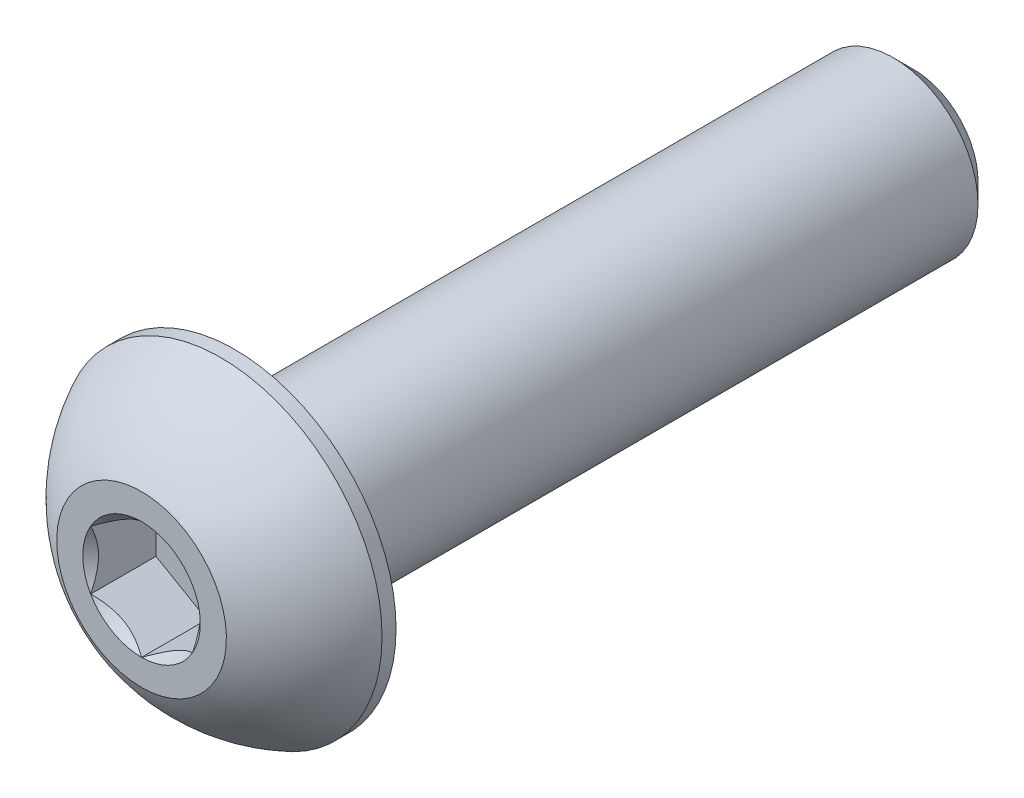
ISO-10303-21;
HEADER;
FILE_DESCRIPTION(('STEP AP214'),'2;1');
FILE_NAME('part.step','',(''),(''),'','','');
FILE_SCHEMA(('AUTOMOTIVE_DESIGN { 1 0 10303 214 1 1 1 1 }'));
ENDSEC;
DATA;
#1=APPLICATION_CONTEXT('core data for automotive mechanical design processes');
#2=APPLICATION_PROTOCOL_DEFINITION('international standard','automotive_design',2000,#1);
#3=PRODUCT_CONTEXT('',#1,'mechanical');
#4=PRODUCT('Part','Part','',(#3));
#5=PRODUCT_RELATED_PRODUCT_CATEGORY('part','',(#4));
#6=PRODUCT_DEFINITION_FORMATION('','',#4);
#7=PRODUCT_DEFINITION_CONTEXT('part definition',#1,'design');
#8=PRODUCT_DEFINITION('design','',#6,#7);
#9=PRODUCT_DEFINITION_SHAPE('','',#8);
#10=(LENGTH_UNIT() NAMED_UNIT(*) SI_UNIT(.MILLI.,.METRE.));
#11=(NAMED_UNIT(*) PLANE_ANGLE_UNIT() SI_UNIT($,.RADIAN.));
#12=(NAMED_UNIT(*) SI_UNIT($,.STERADIAN.) SOLID_ANGLE_UNIT());
#13=UNCERTAINTY_MEASURE_WITH_UNIT(LENGTH_MEASURE(1.E-05),#10,'distance_accuracy_value','');
#14=(GEOMETRIC_REPRESENTATION_CONTEXT(3) GLOBAL_UNCERTAINTY_ASSIGNED_CONTEXT((#13)) GLOBAL_UNIT_ASSIGNED_CONTEXT((#10,
#11,#12)) REPRESENTATION_CONTEXT('',''));
#15=CARTESIAN_POINT('',(0.,0.,0.));
#16=DIRECTION('',(0.,0.,1.));
#17=DIRECTION('',(1.,0.,0.));
#18=AXIS2_PLACEMENT_3D('',#15,#16,#17);
#19=CARTESIAN_POINT('',(0.,0.,-22.75));
#20=DIRECTION('',(0.,0.,1.));
#21=DIRECTION('',(1.,0.,0.));
#22=AXIS2_PLACEMENT_3D('',#19,#20,#21);
#23=PLANE('',#22);
#24=CARTESIAN_POINT('',(0.,0.,-22.75));
#25=DIRECTION('',(0.,0.,1.));
#26=DIRECTION('',(1.,0.,0.));
#27=AXIS2_PLACEMENT_3D('',#24,#25,#26);
#28=CIRCLE('',#27,1.90000000000001);
#29=CARTESIAN_POINT('',(1.90000000000001,0.,-22.75));
#30=VERTEX_POINT('',#29);
#31=EDGE_CURVE('E50',#30,#30,#28,.T.);
#32=ORIENTED_EDGE('',*,*,#31,.F.);
#33=EDGE_LOOP('',(#32));
#34=FACE_BOUND('',#33,.T.);
#35=ADVANCED_FACE('F37',(#34),#23,.F.);
#36=CARTESIAN_POINT('',(0.,0.,-22.75));
#37=DIRECTION('',(0.,0.,1.));
#38=DIRECTION('',(1.,0.,0.));
#39=AXIS2_PLACEMENT_3D('',#36,#37,#38);
#40=CONICAL_SURFACE('',#39,1.90000000000001,0.785398163397447);
#41=CARTESIAN_POINT('',(0.,0.,-22.15));
#42=DIRECTION('',(0.,0.,1.));
#43=DIRECTION('',(1.,0.,0.));
#44=AXIS2_PLACEMENT_3D('',#41,#42,#43);
#45=CIRCLE('',#44,2.50000000000001);
#46=CARTESIAN_POINT('',(2.50000000000001,0.,-22.15));
#47=VERTEX_POINT('',#46);
#48=EDGE_CURVE('E176',#47,#47,#45,.T.);
#49=ORIENTED_EDGE('',*,*,#48,.F.);
#50=EDGE_LOOP('',(#49));
#51=FACE_BOUND('',#50,.T.);
#52=ORIENTED_EDGE('',*,*,#31,.T.);
#53=EDGE_LOOP('',(#52));
#54=FACE_BOUND('',#53,.T.);
#55=ADVANCED_FACE('F181',(#51,#54),#40,.T.);
#56=CARTESIAN_POINT('',(0.,0.,0.));
#57=DIRECTION('',(0.,0.,1.));
#58=DIRECTION('',(1.,0.,0.));
#59=AXIS2_PLACEMENT_3D('',#56,#57,#58);
#60=CYLINDRICAL_SURFACE('',#59,2.50000000000001);
#61=CARTESIAN_POINT('',(0.,0.,-2.75));
#62=DIRECTION('',(0.,0.,1.));
#63=DIRECTION('',(1.,0.,0.));
#64=AXIS2_PLACEMENT_3D('',#61,#62,#63);
#65=CIRCLE('',#64,2.50000000000001);
#66=CARTESIAN_POINT('',(2.50000000000001,0.,-2.75));
#67=VERTEX_POINT('',#66);
#68=EDGE_CURVE('E173',#67,#67,#65,.T.);
#69=ORIENTED_EDGE('',*,*,#68,.F.);
#70=EDGE_LOOP('',(#69));
#71=FACE_BOUND('',#70,.T.);
#72=ORIENTED_EDGE('',*,*,#48,.T.);
#73=EDGE_LOOP('',(#72));
#74=FACE_BOUND('',#73,.T.);
#75=ADVANCED_FACE('F187',(#71,#74),#60,.T.);
#76=CARTESIAN_POINT('',(0.,-4.75,-2.75));
#77=DIRECTION('',(0.,0.,1.));
#78=DIRECTION('',(1.,0.,0.));
#79=AXIS2_PLACEMENT_3D('',#76,#77,#78);
#80=PLANE('',#79);
#81=CARTESIAN_POINT('',(0.,0.,-2.75));
#82=DIRECTION('',(0.,0.,1.));
#83=DIRECTION('',(1.,0.,0.));
#84=AXIS2_PLACEMENT_3D('',#81,#82,#83);
#85=CIRCLE('',#84,4.75);
#86=CARTESIAN_POINT('',(4.75,0.,-2.75));
#87=VERTEX_POINT('',#86);
#88=EDGE_CURVE('E167',#87,#87,#85,.T.);
#89=ORIENTED_EDGE('',*,*,#88,.F.);
#90=EDGE_LOOP('',(#89));
#91=FACE_BOUND('',#90,.T.);
#92=ORIENTED_EDGE('',*,*,#68,.T.);
#93=EDGE_LOOP('',(#92));
#94=FACE_BOUND('',#93,.T.);
#95=ADVANCED_FACE('F192',(#91,#94),#80,.F.);
#96=CARTESIAN_POINT('',(0.,0.,-4.65805481283422));
#97=DIRECTION('',(0.,0.,1.));
#98=DIRECTION('',(0.,-1.,0.));
#99=AXIS2_PLACEMENT_3D('',#96,#97,#98);
#100=SPHERICAL_SURFACE('',#99,5.28653711226623);
#101=CARTESIAN_POINT('',(0.,0.,0.));
#102=DIRECTION('',(0.,0.,1.));
#103=DIRECTION('',(1.,0.,0.));
#104=AXIS2_PLACEMENT_3D('',#101,#102,#103);
#105=CIRCLE('',#104,2.50000000000001);
#106=CARTESIAN_POINT('',(0.,-2.50000000000002,0.));
#107=VERTEX_POINT('',#106);
#108=EDGE_CURVE('E170',#107,#107,#105,.T.);
#109=CARTESIAN_POINT('',(0.,0.,-2.3375));
#110=DIRECTION('',(0.,0.,1.));
#111=DIRECTION('',(1.,0.,0.));
#112=AXIS2_PLACEMENT_3D('',#109,#110,#111);
#113=CIRCLE('',#112,4.75);
#114=CARTESIAN_POINT('',(0.,-4.75,-2.3375));
#115=VERTEX_POINT('',#114);
#116=EDGE_CURVE('E164',#115,#115,#113,.T.);
#117=CARTESIAN_POINT('',(0.,-2.50000000000002,0.));
#118=CARTESIAN_POINT('',(0.,-2.53026679982019,-0.0162442824556097));
#119=CARTESIAN_POINT('',(0.,-2.56037522904969,-0.0327836412064135));
#120=CARTESIAN_POINT('',(0.,-2.62026400427659,-0.0664460518821879));
#121=CARTESIAN_POINT('',(0.,-2.65004435027398,-0.0835691038071584));
#122=CARTESIAN_POINT('',(0.,-2.70926561698585,-0.118392441415041));
#123=CARTESIAN_POINT('',(0.,-2.73870653770034,-0.136092727097953));
#124=CARTESIAN_POINT('',(0.,-2.79723777417105,-0.172063794044947));
#125=CARTESIAN_POINT('',(0.,-2.82632808992727,-0.190334575309028));
#126=CARTESIAN_POINT('',(0.,-2.88414706107591,-0.227439694392678));
#127=CARTESIAN_POINT('',(0.,-2.91287571646832,-0.246274032212247));
#128=CARTESIAN_POINT('',(0.,-2.96996045130295,-0.284499106978591));
#129=CARTESIAN_POINT('',(0.,-2.99831653074516,-0.303889843925367));
#130=CARTESIAN_POINT('',(0.,-3.05464533901893,-0.343220349244855));
#131=CARTESIAN_POINT('',(0.,-3.08261806785048,-0.363160117617568));
#132=CARTESIAN_POINT('',(0.,-3.13816954607728,-0.403581109164592));
#133=CARTESIAN_POINT('',(0.,-3.16574829547252,-0.424062332338903));
#134=CARTESIAN_POINT('',(0.,-3.22050133565616,-0.465558451209041));
#135=CARTESIAN_POINT('',(0.,-3.24767562644456,-0.486573346904867));
#136=CARTESIAN_POINT('',(0.,-3.30160942393943,-0.529128825735187));
#137=CARTESIAN_POINT('',(0.,-3.32836893064589,-0.55066940886968));
#138=CARTESIAN_POINT('',(0.,-3.38146299210495,-0.594268077753711));
#139=CARTESIAN_POINT('',(0.,-3.40779754685754,-0.616326163503249));
#140=CARTESIAN_POINT('',(0.,-3.46003169800774,-0.660951456155513));
#141=CARTESIAN_POINT('',(0.,-3.48593129440536,-0.683518663058239));
#142=CARTESIAN_POINT('',(0.,-3.53728568771642,-0.729153623103512));
#143=CARTESIAN_POINT('',(0.,-3.56274048462987,-0.752221376246057));
#144=CARTESIAN_POINT('',(0.,-3.61319560685494,-0.798848663663781));
#145=CARTESIAN_POINT('',(0.,-3.63819593216656,-0.82240819793896));
#146=CARTESIAN_POINT('',(0.,-3.68773261175692,-0.870010095651586));
#147=CARTESIAN_POINT('',(0.,-3.71226896603566,-0.894052459089033));
#148=CARTESIAN_POINT('',(0.,-3.76086838042535,-0.94261087969412));
#149=CARTESIAN_POINT('',(0.,-3.7849314405363,-0.96712693686176));
#150=CARTESIAN_POINT('',(0.,-3.83257512329417,-1.01662342950466));
#151=CARTESIAN_POINT('',(0.,-3.85615574594109,-1.04160386497992));
#152=CARTESIAN_POINT('',(0.,-3.90282559378754,-1.0920196223646));
#153=CARTESIAN_POINT('',(0.,-3.92591481898706,-1.11745494427402));
#154=CARTESIAN_POINT('',(0.,-3.97159309867277,-1.16877080980931));
#155=CARTESIAN_POINT('',(0.,-3.99418215315895,-1.19465135343518));
#156=CARTESIAN_POINT('',(0.,-4.03885150820303,-1.24684782851374));
#157=CARTESIAN_POINT('',(0.,-4.06093180876094,-1.27316375996643));
#158=CARTESIAN_POINT('',(0.,-4.10457526604591,-1.32622101137371));
#159=CARTESIAN_POINT('',(0.,-4.12613842277299,-1.3529623313283));
#160=CARTESIAN_POINT('',(0.,-4.16873939899418,-1.40686019877854));
#161=CARTESIAN_POINT('',(0.,-4.1897772184883,-1.4340167462742));
#162=CARTESIAN_POINT('',(0.,-4.23131952645464,-1.488734750071));
#163=CARTESIAN_POINT('',(0.,-4.25182401492687,-1.51629620637214));
#164=CARTESIAN_POINT('',(0.,-4.29229186971308,-1.5718135551894));
#165=CARTESIAN_POINT('',(0.,-4.31225523602708,-1.59976944770551));
#166=CARTESIAN_POINT('',(0.,-4.35163326096594,-1.65606504649041));
#167=CARTESIAN_POINT('',(0.,-4.3710479195908,-1.68440475275921));
#168=CARTESIAN_POINT('',(0.,-4.40932115213664,-1.74145721073709));
#169=CARTESIAN_POINT('',(0.,-4.42817972605763,-1.77016996244618));
#170=CARTESIAN_POINT('',(0.,-4.46533362339398,-1.82795760128832));
#171=CARTESIAN_POINT('',(0.,-4.48362894680935,-1.85703248842136));
#172=CARTESIAN_POINT('',(0.,-4.51964939166499,-1.91553335033325));
#173=CARTESIAN_POINT('',(0.,-4.53737451310527,-1.94495932511209));
#174=CARTESIAN_POINT('',(0.,-4.57224781803529,-2.00415118173238));
#175=CARTESIAN_POINT('',(0.,-4.58939600152503,-2.03391706357382));
#176=CARTESIAN_POINT('',(0.,-4.62310891815402,-2.09377742234707));
#177=CARTESIAN_POINT('',(0.,-4.63967365129327,-2.12387189927887));
#178=CARTESIAN_POINT('',(0.,-4.67221336026297,-2.18437801974018));
#179=CARTESIAN_POINT('',(0.,-4.68818833609342,-2.21478966326969));
#180=CARTESIAN_POINT('',(0.,-4.71954250823692,-2.27591853680649));
#181=CARTESIAN_POINT('',(0.,-4.73492170454996,-2.30663576681378));
#182=CARTESIAN_POINT('',(0.,-4.75,-2.3375));
#183=B_SPLINE_CURVE_WITH_KNOTS('',3,(#117,#118,#119,#120,#121,#122,#123,#124,#125,#126,#127,
#128,#129,#130,#131,#132,#133,#134,#135,#136,#137,#138,#139,#140,#141,#142,#143,#144,#145,#146,
#147,#148,#149,#150,#151,#152,#153,#154,#155,#156,#157,#158,#159,#160,#161,#162,#163,#164,#165,
#166,#167,#168,#169,#170,#171,#172,#173,#174,#175,#176,#177,#178,#179,#180,#181,#182),
.UNSPECIFIED.,.F.,.F.,(4,2,2,2,2,2,2,2,2,2,2,2,2,2,2,2,2,2,2,2,2,2,2,2,2,2,2,2,2,2,2,2,4),(0.,
0.10304982363783,0.20609964727566,0.309149470913491,0.41219929455132,0.51524911818915,
0.61829894182698,0.72134876546481,0.82439858910264,0.92744841274047,1.0304982363783,
1.13354806001613,1.23659788365396,1.33964770729179,1.44269753092962,1.54574735456745,
1.64879717820528,1.75184700184311,1.85489682548094,1.95794664911877,2.0609964727566,
2.16404629639443,2.26709612003226,2.37014594367009,2.47319576730792,2.57624559094575,
2.67929541458358,2.78234523822141,2.88539506185924,2.98844488549707,3.0914947091349,
3.19454453277273,3.29759435641056),.UNSPECIFIED.);
#184=EDGE_CURVE('BSEAM197',#107,#115,#183,.T.);
#185=ORIENTED_EDGE('',*,*,#108,.F.);
#186=ORIENTED_EDGE('',*,*,#116,.T.);
#187=ORIENTED_EDGE('',*,*,#184,.T.);
#188=ORIENTED_EDGE('',*,*,#184,.F.);
#189=EDGE_LOOP('',(#185,#187,#186,#188));
#190=FACE_BOUND('',#189,.T.);
#191=ADVANCED_FACE('F197',(#190),#100,.T.);
#192=CARTESIAN_POINT('',(0.,-2.50000000000001,0.));
#193=DIRECTION('',(0.,0.,-1.));
#194=DIRECTION('',(-1.,0.,0.));
#195=AXIS2_PLACEMENT_3D('',#192,#193,#194);
#196=PLANE('',#195);
#197=CARTESIAN_POINT('',(0.,0.,0.));
#198=DIRECTION('',(0.,0.,1.));
#199=DIRECTION('',(1.,0.,0.));
#200=AXIS2_PLACEMENT_3D('',#197,#198,#199);
#201=CIRCLE('',#200,1.73205080756888);
#202=CARTESIAN_POINT('',(-1.5,0.866025403784438,0.));
#203=VERTEX_POINT('',#202);
#204=CARTESIAN_POINT('',(-1.5,-0.866025403784439,0.));
#205=VERTEX_POINT('',#204);
#206=EDGE_CURVE('E63',#203,#205,#201,.T.);
#207=ORIENTED_EDGE('',*,*,#206,.F.);
#208=CARTESIAN_POINT('',(0.,1.73205080756888,0.));
#209=VERTEX_POINT('',#208);
#210=EDGE_CURVE('E135',#209,#203,#201,.T.);
#211=ORIENTED_EDGE('',*,*,#210,.F.);
#212=CARTESIAN_POINT('',(1.5,0.866025403784435,0.));
#213=VERTEX_POINT('',#212);
#214=EDGE_CURVE('E132',#213,#209,#201,.T.);
#215=ORIENTED_EDGE('',*,*,#214,.F.);
#216=CARTESIAN_POINT('',(1.5,-0.866025403784436,0.));
#217=VERTEX_POINT('',#216);
#218=EDGE_CURVE('E103',#217,#213,#201,.T.);
#219=ORIENTED_EDGE('',*,*,#218,.F.);
#220=CARTESIAN_POINT('',(0.,-1.73205080756888,0.));
#221=VERTEX_POINT('',#220);
#222=EDGE_CURVE('E95',#221,#217,#201,.T.);
#223=ORIENTED_EDGE('',*,*,#222,.F.);
#224=EDGE_CURVE('E56',#205,#221,#201,.T.);
#225=ORIENTED_EDGE('',*,*,#224,.F.);
#226=EDGE_LOOP('',(#207,#211,#215,#219,#223,#225));
#227=FACE_BOUND('',#226,.T.);
#228=ORIENTED_EDGE('',*,*,#108,.T.);
#229=EDGE_LOOP('',(#228));
#230=FACE_BOUND('',#229,.T.);
#231=ADVANCED_FACE('F129',(#227,#230),#196,.F.);
#232=CARTESIAN_POINT('',(0.,0.,0.));
#233=DIRECTION('',(0.,0.,1.));
#234=DIRECTION('',(1.,0.,0.));
#235=AXIS2_PLACEMENT_3D('',#232,#233,#234);
#236=CYLINDRICAL_SURFACE('',#235,4.75);
#237=ORIENTED_EDGE('',*,*,#116,.F.);
#238=EDGE_LOOP('',(#237));
#239=FACE_BOUND('',#238,.T.);
#240=ORIENTED_EDGE('',*,*,#88,.T.);
#241=EDGE_LOOP('',(#240));
#242=FACE_BOUND('',#241,.T.);
#243=ADVANCED_FACE('F203',(#239,#242),#236,.T.);
#244=CARTESIAN_POINT('',(0.,0.,0.));
#245=DIRECTION('',(0.,0.,1.));
#246=DIRECTION('',(1.,0.,0.));
#247=AXIS2_PLACEMENT_3D('',#244,#245,#246);
#248=CONICAL_SURFACE('',#247,1.73205080756888,0.78539816339745);
#249=ORIENTED_EDGE('',*,*,#218,.T.);
#250=CARTESIAN_POINT('',(1.5,-1.72720812969692,0.555578516270788));
#251=CARTESIAN_POINT('',(1.5,-1.68515175699267,0.523829907857423));
#252=CARTESIAN_POINT('',(1.5,-1.64286104748673,0.49239259380738));
#253=CARTESIAN_POINT('',(1.5,-1.55771581035941,0.430269087556407));
#254=CARTESIAN_POINT('',(1.5,-1.51486114386668,0.3995830858922));
#255=CARTESIAN_POINT('',(1.5,-1.3846813415127,0.308407192427159));
#256=CARTESIAN_POINT('',(1.5,-1.29637976071653,0.249288343426771));
#257=CARTESIAN_POINT('',(1.5,-1.11121478730467,0.133230996316503));
#258=CARTESIAN_POINT('',(1.5,-1.01415038238167,0.0766095587330072));
#259=CARTESIAN_POINT('',(1.5,-0.815173408897602,-0.0269631187343471));
#260=CARTESIAN_POINT('',(1.5,-0.713278669253282,-0.0739469584583303));
#261=CARTESIAN_POINT('',(1.5,-0.560333774943109,-0.13142733156917));
#262=CARTESIAN_POINT('',(1.5,-0.51154798294804,-0.14792461224275));
#263=CARTESIAN_POINT('',(1.5,-0.412798620136864,-0.177002487072995));
#264=CARTESIAN_POINT('',(1.5,-0.36283496843756,-0.18958281140598));
#265=CARTESIAN_POINT('',(1.5,-0.26286323544498,-0.209963805853229));
#266=CARTESIAN_POINT('',(1.5,-0.212872113808021,-0.217846367254018));
#267=CARTESIAN_POINT('',(1.5,-0.112355243569544,-0.228677936030995));
#268=CARTESIAN_POINT('',(1.5,-0.0618295883726266,-0.231627791475648));
#269=CARTESIAN_POINT('',(1.5,0.0374291733323851,-0.232375142275149));
#270=CARTESIAN_POINT('',(1.5,0.0861609672002999,-0.230355266441923));
#271=CARTESIAN_POINT('',(1.5,0.183206937768828,-0.22167744710324));
#272=CARTESIAN_POINT('',(1.5,0.231521073438269,-0.215019053031542));
#273=CARTESIAN_POINT('',(1.5,0.328199853425436,-0.197314755877431));
#274=CARTESIAN_POINT('',(1.5,0.376550616310328,-0.18619418874296));
#275=CARTESIAN_POINT('',(1.5,0.472195697125599,-0.160156585951287));
#276=CARTESIAN_POINT('',(1.5,0.519490103092741,-0.145239867959063));
#277=CARTESIAN_POINT('',(1.5,0.668391282696625,-0.0926647764039259));
#278=CARTESIAN_POINT('',(1.5,0.767878709508553,-0.0490187125280229));
#279=CARTESIAN_POINT('',(1.5,0.962179866690724,0.0480229945930991));
#280=CARTESIAN_POINT('',(1.5,1.05697519961444,0.101453665089536));
#281=CARTESIAN_POINT('',(1.5,1.23814273533383,0.21168585200456));
#282=CARTESIAN_POINT('',(1.5,1.3246994218129,0.268187920698598));
#283=CARTESIAN_POINT('',(1.5,1.45222331290673,0.355534301578662));
#284=CARTESIAN_POINT('',(1.5,1.49418091978756,0.384957758680046));
#285=CARTESIAN_POINT('',(1.5,1.57752272931476,0.444582821830467));
#286=CARTESIAN_POINT('',(1.5,1.61890708647354,0.47478421166444));
#287=CARTESIAN_POINT('',(1.5,1.66005278019494,0.505308178609459));
#288=B_SPLINE_CURVE_WITH_KNOTS('',3,(#250,#251,#252,#253,#254,#255,#256,#257,#258,#259,#260,
#261,#262,#263,#264,#265,#266,#267,#268,#269,#270,#271,#272,#273,#274,#275,#276,#277,#278,#279,
#280,#281,#282,#283,#284,#285,#286,#287),.UNSPECIFIED.,.F.,.F.,(4,2,2,2,2,2,2,2,2,2,2,2,2,2,2,2,
2,2,4),(0.,0.158079548982668,0.316198780993941,0.634850417346956,0.971690311361506,
1.30737131660666,1.46173961127088,1.61611853740677,1.76772101421409,1.91929742368537,
2.065387412096,2.21149159305544,2.36014984633872,2.50879566386709,2.83376031422673,
3.15991186985651,3.46985601802197,3.62358896039973,3.7772796264207),.UNSPECIFIED.);
#289=EDGE_CURVE('E11',#217,#213,#288,.T.);
#290=ORIENTED_EDGE('',*,*,#289,.F.);
#291=EDGE_LOOP('',(#249,#290));
#292=FACE_BOUND('',#291,.T.);
#293=ADVANCED_FACE('F107',(#292),#248,.F.);
#294=ORIENTED_EDGE('',*,*,#214,.T.);
#295=CARTESIAN_POINT('',(1.5002,0.8659099337306,0.000115481600074659));
#296=CARTESIAN_POINT('',(1.44863220926292,0.895682611594165,-0.029634523932671));
#297=CARTESIAN_POINT('',(1.3962020823348,0.925953159489764,-0.0576375160896862));
#298=CARTESIAN_POINT('',(1.2892909659444,0.987678321317122,-0.108910769559856));
#299=CARTESIAN_POINT('',(1.23479980418534,1.01913880822717,-0.132152494955626));
#300=CARTESIAN_POINT('',(1.12492091864275,1.08257741237344,-0.171966271007779));
#301=CARTESIAN_POINT('',(1.0695611909048,1.11453936608521,-0.188638414329103));
#302=CARTESIAN_POINT('',(0.957622742522849,1.1791670593912,-0.214325543181896));
#303=CARTESIAN_POINT('',(0.901047443446991,1.21183082354213,-0.223359709521133));
#304=CARTESIAN_POINT('',(0.803544610483559,1.26812411040032,-0.231510918773147));
#305=CARTESIAN_POINT('',(0.762743091719533,1.29168087824208,-0.232717747010783));
#306=CARTESIAN_POINT('',(0.681212030384141,1.33875285845138,-0.230685942837732));
#307=CARTESIAN_POINT('',(0.640482505685369,1.36226806050018,-0.227446329251692));
#308=CARTESIAN_POINT('',(0.559415597836583,1.40907206156905,-0.216708014018038));
#309=CARTESIAN_POINT('',(0.519078615401711,1.43236062923612,-0.209205346981266));
#310=CARTESIAN_POINT('',(0.439081663085969,1.47854689118996,-0.190348388071709));
#311=CARTESIAN_POINT('',(0.399421991483792,1.50144441326545,-0.178992442981415));
#312=CARTESIAN_POINT('',(0.297836865225515,1.56009461325633,-0.145278352407328));
#313=CARTESIAN_POINT('',(0.236541446290311,1.59548353987866,-0.120378150906632));
#314=CARTESIAN_POINT('',(0.146414371536687,1.64751843074894,-0.0783433467284234));
#315=CARTESIAN_POINT('',(0.116714860092283,1.66466545167617,-0.0635748464409036));
#316=CARTESIAN_POINT('',(0.0578620986162495,1.69864410935691,-0.0326894340598312));
#317=CARTESIAN_POINT('',(0.0287085957793633,1.7154758920676,-0.0165731658782895));
#318=CARTESIAN_POINT('',(-0.000199999999999511,1.73216627762271,0.000115481600073514));
#319=B_SPLINE_CURVE_WITH_KNOTS('',3,(#295,#296,#297,#298,#299,#300,#301,#302,#303,#304,#305,
#306,#307,#308,#309,#310,#311,#312,#313,#314,#315,#316,#317,#318),.UNSPECIFIED.,.F.,.F.,(4,2,2,
2,2,2,2,2,2,2,2,4),(0.,0.199829143693305,0.400822987382389,0.598623720538181,0.79592624018889,
0.937113067959882,1.07833105577193,1.21968061668222,1.36109089931054,1.58570969637565,
1.69770705470964,1.80965120737194),.UNSPECIFIED.);
#320=EDGE_CURVE('E134',#213,#209,#319,.T.);
#321=ORIENTED_EDGE('',*,*,#320,.F.);
#322=EDGE_LOOP('',(#294,#321));
#323=FACE_BOUND('',#322,.T.);
#324=ADVANCED_FACE('F290',(#323),#248,.F.);
#325=ORIENTED_EDGE('',*,*,#210,.T.);
#326=CARTESIAN_POINT('',(0.000200000000000433,1.73216627762271,0.000115481600073662));
#327=CARTESIAN_POINT('',(-0.0513677907370754,1.70239359975915,-0.0296345239326721));
#328=CARTESIAN_POINT('',(-0.1037979176652,1.67212305186355,-0.0576375160896873));
#329=CARTESIAN_POINT('',(-0.210709034055596,1.61039789003619,-0.108910769559857));
#330=CARTESIAN_POINT('',(-0.265200195814661,1.57893740312614,-0.132152494955627));
#331=CARTESIAN_POINT('',(-0.375079081357248,1.51549879897987,-0.17196627100778));
#332=CARTESIAN_POINT('',(-0.430438809095199,1.4835368452681,-0.188638414329104));
#333=CARTESIAN_POINT('',(-0.54237725747715,1.41890915196211,-0.214325543181897));
#334=CARTESIAN_POINT('',(-0.598952556553008,1.38624538781118,-0.223359709521134));
#335=CARTESIAN_POINT('',(-0.696455389516441,1.32995210095299,-0.231510918773148));
#336=CARTESIAN_POINT('',(-0.737256908280466,1.30639533311124,-0.232717747010783));
#337=CARTESIAN_POINT('',(-0.818787969615858,1.25932335290193,-0.230685942837733));
#338=CARTESIAN_POINT('',(-0.85951749431463,1.23580815085313,-0.227446329251692));
#339=CARTESIAN_POINT('',(-0.940584402163416,1.18900414978426,-0.216708014018038));
#340=CARTESIAN_POINT('',(-0.980921384598288,1.16571558211719,-0.209205346981267));
#341=CARTESIAN_POINT('',(-1.06091833691403,1.11952932016335,-0.190348388071709));
#342=CARTESIAN_POINT('',(-1.10057800851621,1.09663179808786,-0.178992442981415));
#343=CARTESIAN_POINT('',(-1.20216313477448,1.03798159809698,-0.145278352407328));
#344=CARTESIAN_POINT('',(-1.26345855370969,1.00259267147465,-0.120378150906633));
#345=CARTESIAN_POINT('',(-1.35358562846331,0.950557780604373,-0.0783433467284238));
#346=CARTESIAN_POINT('',(-1.38328513990772,0.933410759677146,-0.063574846440904));
#347=CARTESIAN_POINT('',(-1.44213790138375,0.899432101996406,-0.0326894340598315));
#348=CARTESIAN_POINT('',(-1.47129140422064,0.882600319285709,-0.0165731658782898));
#349=CARTESIAN_POINT('',(-1.5002,0.8659099337306,0.000115481600073161));
#350=B_SPLINE_CURVE_WITH_KNOTS('',3,(#326,#327,#328,#329,#330,#331,#332,#333,#334,#335,#336,
#337,#338,#339,#340,#341,#342,#343,#344,#345,#346,#347,#348,#349),.UNSPECIFIED.,.F.,.F.,(4,2,2,
2,2,2,2,2,2,2,2,4),(0.,0.199829143693305,0.400822987382389,0.598623720538181,0.79592624018889,
0.937113067959882,1.07833105577193,1.21968061668222,1.36109089931054,1.58570969637565,
1.69770705470963,1.80965120737193),.UNSPECIFIED.);
#351=EDGE_CURVE('E139',#209,#203,#350,.T.);
#352=ORIENTED_EDGE('',*,*,#351,.F.);
#353=EDGE_LOOP('',(#325,#352));
#354=FACE_BOUND('',#353,.T.);
#355=ADVANCED_FACE('F142',(#354),#248,.F.);
#356=ORIENTED_EDGE('',*,*,#206,.T.);
#357=CARTESIAN_POINT('',(-1.5,-1.72720812969692,0.55557851627079));
#358=CARTESIAN_POINT('',(-1.5,-1.68515175699268,0.523829907857425));
#359=CARTESIAN_POINT('',(-1.5,-1.64286104748673,0.492392593807382));
#360=CARTESIAN_POINT('',(-1.5,-1.55771581035942,0.430269087556408));
#361=CARTESIAN_POINT('',(-1.5,-1.51486114386668,0.399583085892201));
#362=CARTESIAN_POINT('',(-1.5,-1.3846813415127,0.30840719242716));
#363=CARTESIAN_POINT('',(-1.5,-1.29637976071654,0.249288343426772));
#364=CARTESIAN_POINT('',(-1.5,-1.11121478730467,0.133230996316504));
#365=CARTESIAN_POINT('',(-1.5,-1.01415038238167,0.0766095587330075));
#366=CARTESIAN_POINT('',(-1.5,-0.815173408897605,-0.0269631187343474));
#367=CARTESIAN_POINT('',(-1.5,-0.713278669253285,-0.0739469584583307));
#368=CARTESIAN_POINT('',(-1.5,-0.560333774943112,-0.13142733156917));
#369=CARTESIAN_POINT('',(-1.5,-0.511547982948042,-0.147924612242751));
#370=CARTESIAN_POINT('',(-1.5,-0.412798620136867,-0.177002487072996));
#371=CARTESIAN_POINT('',(-1.5,-0.362834968437563,-0.189582811405981));
#372=CARTESIAN_POINT('',(-1.5,-0.262863235444982,-0.20996380585323));
#373=CARTESIAN_POINT('',(-1.5,-0.212872113808023,-0.21784636725402));
#374=CARTESIAN_POINT('',(-1.5,-0.112355243569546,-0.228677936030997));
#375=CARTESIAN_POINT('',(-1.5,-0.0618295883726285,-0.231627791475649));
#376=CARTESIAN_POINT('',(-1.5,0.0374291733323832,-0.23237514227515));
#377=CARTESIAN_POINT('',(-1.5,0.086160967200298,-0.230355266441925));
#378=CARTESIAN_POINT('',(-1.5,0.183206937768826,-0.221677447103242));
#379=CARTESIAN_POINT('',(-1.5,0.231521073438268,-0.215019053031544));
#380=CARTESIAN_POINT('',(-1.5,0.328199853425435,-0.197314755877433));
#381=CARTESIAN_POINT('',(-1.5,0.376550616310327,-0.186194188742962));
#382=CARTESIAN_POINT('',(-1.5,0.472195697125597,-0.160156585951289));
#383=CARTESIAN_POINT('',(-1.5,0.519490103092739,-0.145239867959065));
#384=CARTESIAN_POINT('',(-1.5,0.668391282696623,-0.0926647764039278));
#385=CARTESIAN_POINT('',(-1.5,0.767878709508551,-0.0490187125280251));
#386=CARTESIAN_POINT('',(-1.5,0.962179866690722,0.0480229945930965));
#387=CARTESIAN_POINT('',(-1.5,1.05697519961444,0.101453665089533));
#388=CARTESIAN_POINT('',(-1.5,1.23814273533382,0.211685852004557));
#389=CARTESIAN_POINT('',(-1.5,1.32469942181289,0.268187920698595));
#390=CARTESIAN_POINT('',(-1.5,1.45222331290673,0.355534301578658));
#391=CARTESIAN_POINT('',(-1.5,1.49418091978755,0.384957758680042));
#392=CARTESIAN_POINT('',(-1.5,1.57752272931476,0.444582821830462));
#393=CARTESIAN_POINT('',(-1.5,1.61890708647354,0.474784211664436));
#394=CARTESIAN_POINT('',(-1.5,1.66005278019494,0.505308178609454));
#395=B_SPLINE_CURVE_WITH_KNOTS('',3,(#357,#358,#359,#360,#361,#362,#363,#364,#365,#366,#367,
#368,#369,#370,#371,#372,#373,#374,#375,#376,#377,#378,#379,#380,#381,#382,#383,#384,#385,#386,
#387,#388,#389,#390,#391,#392,#393,#394),.UNSPECIFIED.,.F.,.F.,(4,2,2,2,2,2,2,2,2,2,2,2,2,2,2,2,
2,2,4),(0.,0.158079548982668,0.316198780993941,0.634850417346957,0.971690311361509,
1.30737131660667,1.46173961127088,1.61611853740677,1.76772101421409,1.91929742368538,
2.065387412096,2.21149159305544,2.36014984633872,2.50879566386709,2.83376031422673,
3.15991186985651,3.46985601802197,3.62358896039973,3.7772796264207),.UNSPECIFIED.);
#396=EDGE_CURVE('E146',#203,#205,#395,.F.);
#397=ORIENTED_EDGE('',*,*,#396,.F.);
#398=EDGE_LOOP('',(#356,#397));
#399=FACE_BOUND('',#398,.T.);
#400=ADVANCED_FACE('F284',(#399),#248,.F.);
#401=ORIENTED_EDGE('',*,*,#224,.T.);
#402=CARTESIAN_POINT('',(-1.5002,-0.8659099337306,0.000115481600073141));
#403=CARTESIAN_POINT('',(-1.44863220926292,-0.895682611594165,-0.0296345239326726));
#404=CARTESIAN_POINT('',(-1.3962020823348,-0.925953159489764,-0.0576375160896876));
#405=CARTESIAN_POINT('',(-1.2892909659444,-0.987678321317123,-0.108910769559857));
#406=CARTESIAN_POINT('',(-1.23479980418534,-1.01913880822717,-0.132152494955627));
#407=CARTESIAN_POINT('',(-1.12492091864275,-1.08257741237344,-0.17196627100778));
#408=CARTESIAN_POINT('',(-1.0695611909048,-1.11453936608521,-0.188638414329104));
#409=CARTESIAN_POINT('',(-0.957622742522848,-1.1791670593912,-0.214325543181897));
#410=CARTESIAN_POINT('',(-0.90104744344699,-1.21183082354213,-0.223359709521134));
#411=CARTESIAN_POINT('',(-0.803544610483558,-1.26812411040032,-0.231510918773148));
#412=CARTESIAN_POINT('',(-0.762743091719533,-1.29168087824208,-0.232717747010783));
#413=CARTESIAN_POINT('',(-0.681212030384141,-1.33875285845138,-0.230685942837732));
#414=CARTESIAN_POINT('',(-0.640482505685369,-1.36226806050018,-0.227446329251692));
#415=CARTESIAN_POINT('',(-0.559415597836583,-1.40907206156905,-0.216708014018038));
#416=CARTESIAN_POINT('',(-0.519078615401711,-1.43236062923612,-0.209205346981267));
#417=CARTESIAN_POINT('',(-0.439081663085968,-1.47854689118996,-0.190348388071709));
#418=CARTESIAN_POINT('',(-0.399421991483791,-1.50144441326545,-0.178992442981415));
#419=CARTESIAN_POINT('',(-0.297836865225515,-1.56009461325633,-0.145278352407328));
#420=CARTESIAN_POINT('',(-0.236541446290311,-1.59548353987866,-0.120378150906633));
#421=CARTESIAN_POINT('',(-0.146414371536687,-1.64751843074894,-0.0783433467284239));
#422=CARTESIAN_POINT('',(-0.116714860092283,-1.66466545167617,-0.0635748464409041));
#423=CARTESIAN_POINT('',(-0.0578620986162496,-1.69864410935691,-0.0326894340598317));
#424=CARTESIAN_POINT('',(-0.0287085957793635,-1.7154758920676,-0.01657316587829));
#425=CARTESIAN_POINT('',(0.000199999999999168,-1.73216627762271,0.000115481600072962));
#426=B_SPLINE_CURVE_WITH_KNOTS('',3,(#402,#403,#404,#405,#406,#407,#408,#409,#410,#411,#412,
#413,#414,#415,#416,#417,#418,#419,#420,#421,#422,#423,#424,#425),.UNSPECIFIED.,.F.,.F.,(4,2,2,
2,2,2,2,2,2,2,2,4),(0.,0.199829143693304,0.400822987382388,0.59862372053818,0.795926240188888,
0.93711306795988,1.07833105577193,1.21968061668222,1.36109089931054,1.58570969637565,
1.69770705470963,1.80965120737193),.UNSPECIFIED.);
#427=EDGE_CURVE('E119',#205,#221,#426,.T.);
#428=ORIENTED_EDGE('',*,*,#427,.F.);
#429=EDGE_LOOP('',(#401,#428));
#430=FACE_BOUND('',#429,.T.);
#431=ADVANCED_FACE('F232',(#430),#248,.F.);
#432=ORIENTED_EDGE('',*,*,#222,.T.);
#433=CARTESIAN_POINT('',(-0.00020000000000076,-1.73216627762271,0.000115481600073012));
#434=CARTESIAN_POINT('',(0.051367790737075,-1.70239359975915,-0.0296345239326725));
#435=CARTESIAN_POINT('',(0.1037979176652,-1.67212305186355,-0.0576375160896876));
#436=CARTESIAN_POINT('',(0.210709034055596,-1.61039789003619,-0.108910769559858));
#437=CARTESIAN_POINT('',(0.26520019581466,-1.57893740312614,-0.132152494955628));
#438=CARTESIAN_POINT('',(0.375079081357247,-1.51549879897987,-0.171966271007781));
#439=CARTESIAN_POINT('',(0.430438809095198,-1.4835368452681,-0.188638414329104));
#440=CARTESIAN_POINT('',(0.542377257477149,-1.41890915196211,-0.214325543181897));
#441=CARTESIAN_POINT('',(0.598952556553007,-1.38624538781118,-0.223359709521135));
#442=CARTESIAN_POINT('',(0.696455389516439,-1.32995210095299,-0.231510918773149));
#443=CARTESIAN_POINT('',(0.737256908280465,-1.30639533311124,-0.232717747010784));
#444=CARTESIAN_POINT('',(0.818787969615857,-1.25932335290193,-0.230685942837733));
#445=CARTESIAN_POINT('',(0.859517494314628,-1.23580815085313,-0.227446329251693));
#446=CARTESIAN_POINT('',(0.940584402163414,-1.18900414978426,-0.216708014018039));
#447=CARTESIAN_POINT('',(0.980921384598286,-1.16571558211719,-0.209205346981268));
#448=CARTESIAN_POINT('',(1.06091833691403,-1.11952932016335,-0.19034838807171));
#449=CARTESIAN_POINT('',(1.10057800851621,-1.09663179808786,-0.178992442981416));
#450=CARTESIAN_POINT('',(1.20216313477448,-1.03798159809698,-0.145278352407329));
#451=CARTESIAN_POINT('',(1.26345855370969,-1.00259267147465,-0.120378150906634));
#452=CARTESIAN_POINT('',(1.35358562846331,-0.950557780604372,-0.0783433467284242));
#453=CARTESIAN_POINT('',(1.38328513990772,-0.933410759677145,-0.0635748464409042));
#454=CARTESIAN_POINT('',(1.44213790138375,-0.899432101996404,-0.0326894340598314));
#455=CARTESIAN_POINT('',(1.47129140422064,-0.882600319285707,-0.0165731658782896));
#456=CARTESIAN_POINT('',(1.5002,-0.865909933730598,0.000115481600073517));
#457=B_SPLINE_CURVE_WITH_KNOTS('',3,(#433,#434,#435,#436,#437,#438,#439,#440,#441,#442,#443,
#444,#445,#446,#447,#448,#449,#450,#451,#452,#453,#454,#455,#456),.UNSPECIFIED.,.F.,.F.,(4,2,2,
2,2,2,2,2,2,2,2,4),(0.,0.199829143693305,0.400822987382388,0.59862372053818,0.795926240188889,
0.937113067959881,1.07833105577193,1.21968061668222,1.36109089931054,1.58570969637565,
1.69770705470964,1.80965120737194),.UNSPECIFIED.);
#458=EDGE_CURVE('E99',#221,#217,#457,.T.);
#459=ORIENTED_EDGE('',*,*,#458,.F.);
#460=EDGE_LOOP('',(#432,#459));
#461=FACE_BOUND('',#460,.T.);
#462=ADVANCED_FACE('F97',(#461),#248,.F.);
#463=CARTESIAN_POINT('',(1.5,-0.866025403784436,-1.925));
#464=DIRECTION('',(0.,0.,1.));
#465=DIRECTION('',(1.,0.,0.));
#466=AXIS2_PLACEMENT_3D('',#463,#464,#465);
#467=PLANE('',#466);
#468=DIRECTION('',(0.866025403784438,0.5,0.));
#469=VECTOR('',#468,1.);
#470=CARTESIAN_POINT('',(0.,-1.73205080756888,-1.925));
#471=LINE('',#470,#469);
#472=CARTESIAN_POINT('',(0.,-1.73205080756888,-1.925));
#473=VERTEX_POINT('',#472);
#474=CARTESIAN_POINT('',(1.5,-0.866025403784436,-1.925));
#475=VERTEX_POINT('',#474);
#476=EDGE_CURVE('E118',#473,#475,#471,.T.);
#477=ORIENTED_EDGE('',*,*,#476,.T.);
#478=DIRECTION('',(0.,1.,0.));
#479=VECTOR('',#478,1.);
#480=CARTESIAN_POINT('',(1.5,-0.866025403784436,-1.925));
#481=LINE('',#480,#479);
#482=CARTESIAN_POINT('',(1.5,0.866025403784438,-1.925));
#483=VERTEX_POINT('',#482);
#484=EDGE_CURVE('E123',#475,#483,#481,.T.);
#485=ORIENTED_EDGE('',*,*,#484,.T.);
#486=DIRECTION('',(-0.866025403784439,0.5,0.));
#487=VECTOR('',#486,1.);
#488=CARTESIAN_POINT('',(1.5,0.866025403784438,-1.925));
#489=LINE('',#488,#487);
#490=CARTESIAN_POINT('',(0.,1.73205080756888,-1.925));
#491=VERTEX_POINT('',#490);
#492=EDGE_CURVE('E274',#483,#491,#489,.T.);
#493=ORIENTED_EDGE('',*,*,#492,.T.);
#494=DIRECTION('',(-0.866025403784439,-0.5,0.));
#495=VECTOR('',#494,1.);
#496=CARTESIAN_POINT('',(0.,1.73205080756888,-1.925));
#497=LINE('',#496,#495);
#498=CARTESIAN_POINT('',(-1.5,0.866025403784438,-1.925));
#499=VERTEX_POINT('',#498);
#500=EDGE_CURVE('E155',#491,#499,#497,.T.);
#501=ORIENTED_EDGE('',*,*,#500,.T.);
#502=DIRECTION('',(0.,-1.,0.));
#503=VECTOR('',#502,1.);
#504=CARTESIAN_POINT('',(-1.5,0.866025403784438,-1.925));
#505=LINE('',#504,#503);
#506=CARTESIAN_POINT('',(-1.5,-0.866025403784438,-1.925));
#507=VERTEX_POINT('',#506);
#508=EDGE_CURVE('E278',#499,#507,#505,.T.);
#509=ORIENTED_EDGE('',*,*,#508,.T.);
#510=DIRECTION('',(0.866025403784439,-0.5,0.));
#511=VECTOR('',#510,1.);
#512=CARTESIAN_POINT('',(-1.5,-0.866025403784438,-1.925));
#513=LINE('',#512,#511);
#514=EDGE_CURVE('E126',#507,#473,#513,.T.);
#515=ORIENTED_EDGE('',*,*,#514,.T.);
#516=EDGE_LOOP('',(#477,#485,#493,#501,#509,#515));
#517=FACE_BOUND('',#516,.T.);
#518=ADVANCED_FACE('F231',(#517),#467,.T.);
#519=CARTESIAN_POINT('',(1.5,-0.866025403784436,-1.925));
#520=DIRECTION('',(1.,0.,0.));
#521=DIRECTION('',(0.,1.,0.));
#522=AXIS2_PLACEMENT_3D('',#519,#520,#521);
#523=PLANE('',#522);
#524=DIRECTION('',(0.,0.,1.));
#525=VECTOR('',#524,1.);
#526=CARTESIAN_POINT('',(1.5,-0.866025403784436,-1.925));
#527=LINE('',#526,#525);
#528=EDGE_CURVE('E115',#475,#217,#527,.T.);
#529=ORIENTED_EDGE('',*,*,#528,.T.);
#530=ORIENTED_EDGE('',*,*,#289,.T.);
#531=DIRECTION('',(0.,0.,1.));
#532=VECTOR('',#531,1.);
#533=CARTESIAN_POINT('',(1.5,0.866025403784438,-1.925));
#534=LINE('',#533,#532);
#535=EDGE_CURVE('E125',#483,#213,#534,.T.);
#536=ORIENTED_EDGE('',*,*,#535,.F.);
#537=ORIENTED_EDGE('',*,*,#484,.F.);
#538=EDGE_LOOP('',(#529,#530,#536,#537));
#539=FACE_BOUND('',#538,.T.);
#540=ADVANCED_FACE('F121',(#539),#523,.F.);
#541=CARTESIAN_POINT('',(1.5,0.866025403784438,-1.925));
#542=DIRECTION('',(0.5,0.866025403784439,0.));
#543=DIRECTION('',(-0.866025403784439,0.5,0.));
#544=AXIS2_PLACEMENT_3D('',#541,#542,#543);
#545=PLANE('',#544);
#546=ORIENTED_EDGE('',*,*,#535,.T.);
#547=ORIENTED_EDGE('',*,*,#320,.T.);
#548=DIRECTION('',(0.,0.,1.));
#549=VECTOR('',#548,1.);
#550=CARTESIAN_POINT('',(0.,1.73205080756888,-1.925));
#551=LINE('',#550,#549);
#552=EDGE_CURVE('E151',#491,#209,#551,.T.);
#553=ORIENTED_EDGE('',*,*,#552,.F.);
#554=ORIENTED_EDGE('',*,*,#492,.F.);
#555=EDGE_LOOP('',(#546,#547,#553,#554));
#556=FACE_BOUND('',#555,.T.);
#557=ADVANCED_FACE('F149',(#556),#545,.F.);
#558=CARTESIAN_POINT('',(0.,1.73205080756888,-1.925));
#559=DIRECTION('',(-0.5,0.866025403784439,0.));
#560=DIRECTION('',(-0.866025403784439,-0.5,0.));
#561=AXIS2_PLACEMENT_3D('',#558,#559,#560);
#562=PLANE('',#561);
#563=ORIENTED_EDGE('',*,*,#552,.T.);
#564=ORIENTED_EDGE('',*,*,#351,.T.);
#565=DIRECTION('',(0.,0.,1.));
#566=VECTOR('',#565,1.);
#567=CARTESIAN_POINT('',(-1.5,0.866025403784438,-1.925));
#568=LINE('',#567,#566);
#569=EDGE_CURVE('E157',#499,#203,#568,.T.);
#570=ORIENTED_EDGE('',*,*,#569,.F.);
#571=ORIENTED_EDGE('',*,*,#500,.F.);
#572=EDGE_LOOP('',(#563,#564,#570,#571));
#573=FACE_BOUND('',#572,.T.);
#574=ADVANCED_FACE('F153',(#573),#562,.F.);
#575=CARTESIAN_POINT('',(-1.5,0.866025403784438,-1.925));
#576=DIRECTION('',(-1.,0.,0.));
#577=DIRECTION('',(0.,-1.,0.));
#578=AXIS2_PLACEMENT_3D('',#575,#576,#577);
#579=PLANE('',#578);
#580=ORIENTED_EDGE('',*,*,#569,.T.);
#581=ORIENTED_EDGE('',*,*,#396,.T.);
#582=DIRECTION('',(0.,0.,1.));
#583=VECTOR('',#582,1.);
#584=CARTESIAN_POINT('',(-1.5,-0.866025403784438,-1.925));
#585=LINE('',#584,#583);
#586=EDGE_CURVE('E159',#507,#205,#585,.T.);
#587=ORIENTED_EDGE('',*,*,#586,.F.);
#588=ORIENTED_EDGE('',*,*,#508,.F.);
#589=EDGE_LOOP('',(#580,#581,#587,#588));
#590=FACE_BOUND('',#589,.T.);
#591=ADVANCED_FACE('F253',(#590),#579,.F.);
#592=CARTESIAN_POINT('',(-1.5,-0.866025403784438,-1.925));
#593=DIRECTION('',(-0.5,-0.866025403784439,0.));
#594=DIRECTION('',(0.866025403784439,-0.5,0.));
#595=AXIS2_PLACEMENT_3D('',#592,#593,#594);
#596=PLANE('',#595);
#597=ORIENTED_EDGE('',*,*,#586,.T.);
#598=ORIENTED_EDGE('',*,*,#427,.T.);
#599=DIRECTION('',(0.,0.,1.));
#600=VECTOR('',#599,1.);
#601=CARTESIAN_POINT('',(0.,-1.73205080756888,-1.925));
#602=LINE('',#601,#600);
#603=EDGE_CURVE('E117',#473,#221,#602,.T.);
#604=ORIENTED_EDGE('',*,*,#603,.F.);
#605=ORIENTED_EDGE('',*,*,#514,.F.);
#606=EDGE_LOOP('',(#597,#598,#604,#605));
#607=FACE_BOUND('',#606,.T.);
#608=ADVANCED_FACE('F212',(#607),#596,.F.);
#609=CARTESIAN_POINT('',(0.,-1.73205080756888,-1.925));
#610=DIRECTION('',(0.5,-0.866025403784438,0.));
#611=DIRECTION('',(0.866025403784439,0.5,0.));
#612=AXIS2_PLACEMENT_3D('',#609,#610,#611);
#613=PLANE('',#612);
#614=ORIENTED_EDGE('',*,*,#603,.T.);
#615=ORIENTED_EDGE('',*,*,#458,.T.);
#616=ORIENTED_EDGE('',*,*,#528,.F.);
#617=ORIENTED_EDGE('',*,*,#476,.F.);
#618=EDGE_LOOP('',(#614,#615,#616,#617));
#619=FACE_BOUND('',#618,.T.);
#620=ADVANCED_FACE('F113',(#619),#613,.F.);
#621=CLOSED_SHELL('',(#35,#55,#75,#95,#191,#231,#243,#293,#324,#355,#400,#431,#462,#518,#540,
#557,#574,#591,#608,#620));
#622=MANIFOLD_SOLID_BREP('B2',#621);
#623=ADVANCED_BREP_SHAPE_REPRESENTATION('',(#18,#622),#14);
#624=SHAPE_DEFINITION_REPRESENTATION(#9,#623);
ENDSEC;
END-ISO-10303-21;
